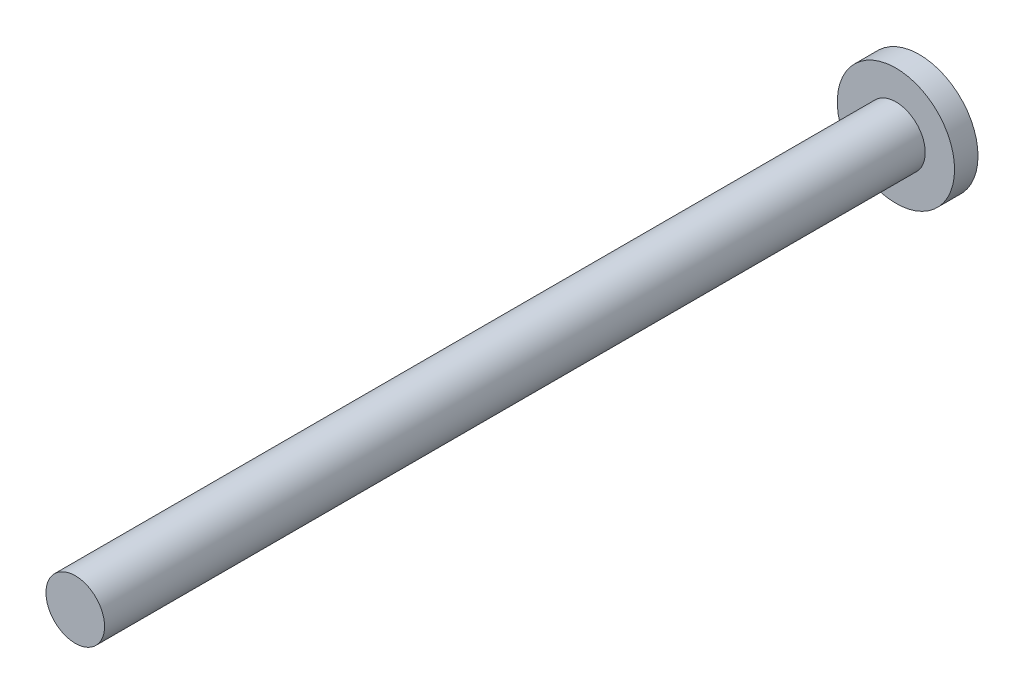
ISO-10303-21;
HEADER;
FILE_DESCRIPTION(('STEP AP214'),'2;1');
FILE_NAME('part.step','',(''),(''),'','','');
FILE_SCHEMA(('AUTOMOTIVE_DESIGN { 1 0 10303 214 1 1 1 1 }'));
ENDSEC;
DATA;
#1=APPLICATION_CONTEXT('core data for automotive mechanical design processes');
#2=APPLICATION_PROTOCOL_DEFINITION('international standard','automotive_design',2000,#1);
#3=PRODUCT_CONTEXT('',#1,'mechanical');
#4=PRODUCT('Part','Part','',(#3));
#5=PRODUCT_RELATED_PRODUCT_CATEGORY('part','',(#4));
#6=PRODUCT_DEFINITION_FORMATION('','',#4);
#7=PRODUCT_DEFINITION_CONTEXT('part definition',#1,'design');
#8=PRODUCT_DEFINITION('design','',#6,#7);
#9=PRODUCT_DEFINITION_SHAPE('','',#8);
#10=(LENGTH_UNIT() NAMED_UNIT(*) SI_UNIT(.MILLI.,.METRE.));
#11=(NAMED_UNIT(*) PLANE_ANGLE_UNIT() SI_UNIT($,.RADIAN.));
#12=(NAMED_UNIT(*) SI_UNIT($,.STERADIAN.) SOLID_ANGLE_UNIT());
#13=UNCERTAINTY_MEASURE_WITH_UNIT(LENGTH_MEASURE(1.E-05),#10,'distance_accuracy_value','');
#14=(GEOMETRIC_REPRESENTATION_CONTEXT(3) GLOBAL_UNCERTAINTY_ASSIGNED_CONTEXT((#13)) GLOBAL_UNIT_ASSIGNED_CONTEXT((#10,
#11,#12)) REPRESENTATION_CONTEXT('',''));
#15=CARTESIAN_POINT('',(0.,0.,0.));
#16=DIRECTION('',(0.,0.,1.));
#17=DIRECTION('',(1.,0.,0.));
#18=AXIS2_PLACEMENT_3D('',#15,#16,#17);
#19=CARTESIAN_POINT('',(2.5,0.,0.));
#20=DIRECTION('',(0.,0.,1.));
#21=DIRECTION('',(1.,0.,0.));
#22=AXIS2_PLACEMENT_3D('',#19,#20,#21);
#23=PLANE('',#22);
#24=CARTESIAN_POINT('',(0.,0.,0.));
#25=DIRECTION('',(0.,0.,1.));
#26=DIRECTION('',(1.,0.,0.));
#27=AXIS2_PLACEMENT_3D('',#24,#25,#26);
#28=CIRCLE('',#27,2.5);
#29=CARTESIAN_POINT('',(2.5,0.,0.));
#30=VERTEX_POINT('',#29);
#31=EDGE_CURVE('E45',#30,#30,#28,.T.);
#32=ORIENTED_EDGE('',*,*,#31,.T.);
#33=EDGE_LOOP('',(#32));
#34=FACE_BOUND('',#33,.T.);
#35=ADVANCED_FACE('F31',(#34),#23,.T.);
#36=CARTESIAN_POINT('',(0.,0.,-72.));
#37=DIRECTION('',(0.,0.,-1.));
#38=DIRECTION('',(-1.,0.,0.));
#39=AXIS2_PLACEMENT_3D('',#36,#37,#38);
#40=PLANE('',#39);
#41=CARTESIAN_POINT('',(0.,0.,-72.));
#42=DIRECTION('',(0.,0.,1.));
#43=DIRECTION('',(1.,0.,0.));
#44=AXIS2_PLACEMENT_3D('',#41,#42,#43);
#45=CIRCLE('',#44,4.99999999999999);
#46=CARTESIAN_POINT('',(4.99999999999999,0.,-72.));
#47=VERTEX_POINT('',#46);
#48=EDGE_CURVE('E10',#47,#47,#45,.T.);
#49=ORIENTED_EDGE('',*,*,#48,.F.);
#50=EDGE_LOOP('',(#49));
#51=FACE_BOUND('',#50,.T.);
#52=ADVANCED_FACE('F63',(#51),#40,.T.);
#53=CARTESIAN_POINT('',(0.,0.,0.));
#54=DIRECTION('',(0.,0.,1.));
#55=DIRECTION('',(1.,0.,0.));
#56=AXIS2_PLACEMENT_3D('',#53,#54,#55);
#57=CYLINDRICAL_SURFACE('',#56,4.99999999999999);
#58=ORIENTED_EDGE('',*,*,#48,.T.);
#59=EDGE_LOOP('',(#58));
#60=FACE_BOUND('',#59,.T.);
#61=CARTESIAN_POINT('',(0.,0.,-70.));
#62=DIRECTION('',(0.,0.,1.));
#63=DIRECTION('',(1.,0.,0.));
#64=AXIS2_PLACEMENT_3D('',#61,#62,#63);
#65=CIRCLE('',#64,4.99999999999999);
#66=CARTESIAN_POINT('',(4.99999999999999,0.,-70.));
#67=VERTEX_POINT('',#66);
#68=EDGE_CURVE('E37',#67,#67,#65,.T.);
#69=ORIENTED_EDGE('',*,*,#68,.F.);
#70=EDGE_LOOP('',(#69));
#71=FACE_BOUND('',#70,.T.);
#72=ADVANCED_FACE('F60',(#60,#71),#57,.T.);
#73=CARTESIAN_POINT('',(4.99999999999999,0.,-70.));
#74=DIRECTION('',(0.,0.,1.));
#75=DIRECTION('',(1.,0.,0.));
#76=AXIS2_PLACEMENT_3D('',#73,#74,#75);
#77=PLANE('',#76);
#78=ORIENTED_EDGE('',*,*,#68,.T.);
#79=EDGE_LOOP('',(#78));
#80=FACE_BOUND('',#79,.T.);
#81=CARTESIAN_POINT('',(0.,0.,-70.));
#82=DIRECTION('',(0.,0.,1.));
#83=DIRECTION('',(1.,0.,0.));
#84=AXIS2_PLACEMENT_3D('',#81,#82,#83);
#85=CIRCLE('',#84,2.49999999999999);
#86=CARTESIAN_POINT('',(2.49999999999999,0.,-70.));
#87=VERTEX_POINT('',#86);
#88=EDGE_CURVE('E41',#87,#87,#85,.T.);
#89=ORIENTED_EDGE('',*,*,#88,.F.);
#90=EDGE_LOOP('',(#89));
#91=FACE_BOUND('',#90,.T.);
#92=ADVANCED_FACE('F54',(#80,#91),#77,.T.);
#93=CARTESIAN_POINT('',(0.,0.,0.));
#94=DIRECTION('',(0.,0.,1.));
#95=DIRECTION('',(1.,0.,0.));
#96=AXIS2_PLACEMENT_3D('',#93,#94,#95);
#97=CYLINDRICAL_SURFACE('',#96,2.5);
#98=ORIENTED_EDGE('',*,*,#88,.T.);
#99=EDGE_LOOP('',(#98));
#100=FACE_BOUND('',#99,.T.);
#101=ORIENTED_EDGE('',*,*,#31,.F.);
#102=EDGE_LOOP('',(#101));
#103=FACE_BOUND('',#102,.T.);
#104=ADVANCED_FACE('F52',(#100,#103),#97,.T.);
#105=CLOSED_SHELL('',(#35,#52,#72,#92,#104));
#106=MANIFOLD_SOLID_BREP('B2',#105);
#107=ADVANCED_BREP_SHAPE_REPRESENTATION('',(#18,#106),#14);
#108=SHAPE_DEFINITION_REPRESENTATION(#9,#107);
ENDSEC;
END-ISO-10303-21;
